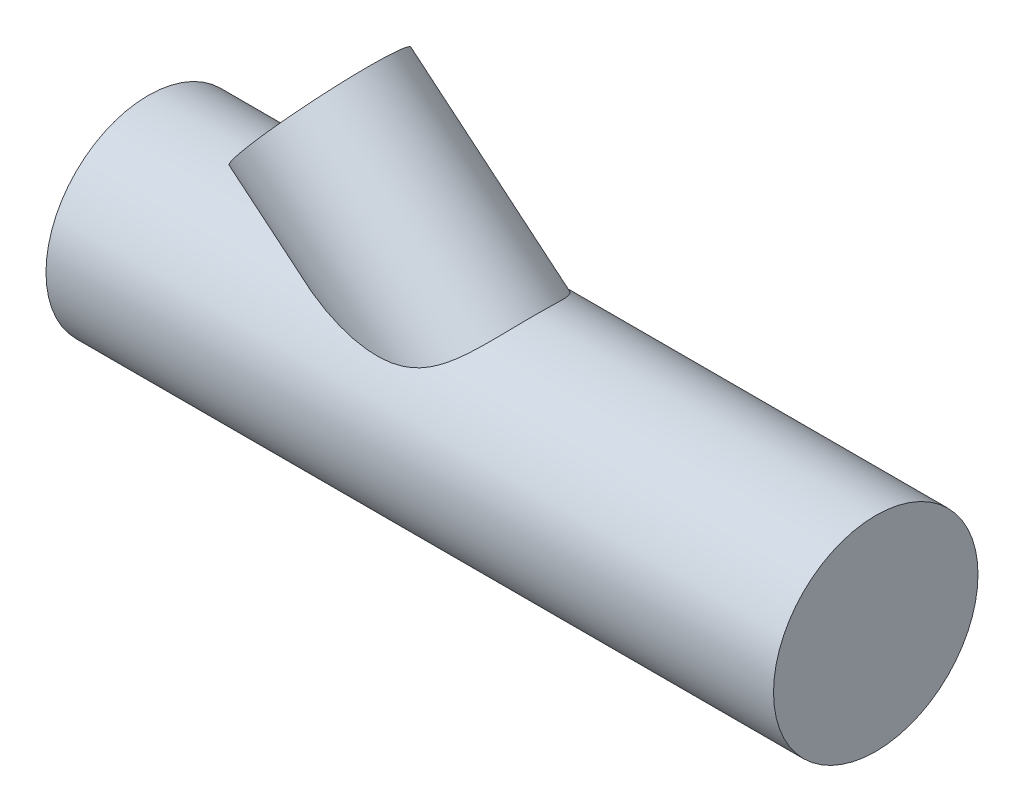
ISO-10303-21;
HEADER;
FILE_DESCRIPTION(('STEP AP214'),'2;1');
FILE_NAME('part.step','',(''),(''),'','','');
FILE_SCHEMA(('AUTOMOTIVE_DESIGN { 1 0 10303 214 1 1 1 1 }'));
ENDSEC;
DATA;
#1=APPLICATION_CONTEXT('core data for automotive mechanical design processes');
#2=APPLICATION_PROTOCOL_DEFINITION('international standard','automotive_design',2000,#1);
#3=PRODUCT_CONTEXT('',#1,'mechanical');
#4=PRODUCT('Part','Part','',(#3));
#5=PRODUCT_RELATED_PRODUCT_CATEGORY('part','',(#4));
#6=PRODUCT_DEFINITION_FORMATION('','',#4);
#7=PRODUCT_DEFINITION_CONTEXT('part definition',#1,'design');
#8=PRODUCT_DEFINITION('design','',#6,#7);
#9=PRODUCT_DEFINITION_SHAPE('','',#8);
#10=(LENGTH_UNIT() NAMED_UNIT(*) SI_UNIT(.MILLI.,.METRE.));
#11=(NAMED_UNIT(*) PLANE_ANGLE_UNIT() SI_UNIT($,.RADIAN.));
#12=(NAMED_UNIT(*) SI_UNIT($,.STERADIAN.) SOLID_ANGLE_UNIT());
#13=UNCERTAINTY_MEASURE_WITH_UNIT(LENGTH_MEASURE(1.E-05),#10,'distance_accuracy_value','');
#14=(GEOMETRIC_REPRESENTATION_CONTEXT(3) GLOBAL_UNCERTAINTY_ASSIGNED_CONTEXT((#13)) GLOBAL_UNIT_ASSIGNED_CONTEXT((#10,
#11,#12)) REPRESENTATION_CONTEXT('',''));
#15=CARTESIAN_POINT('',(0.,0.,0.));
#16=DIRECTION('',(0.,0.,1.));
#17=DIRECTION('',(1.,0.,0.));
#18=AXIS2_PLACEMENT_3D('',#15,#16,#17);
#19=CARTESIAN_POINT('',(-69.3240097841989,11.2302504074532,0.));
#20=DIRECTION('',(-1.,0.,0.));
#21=DIRECTION('',(0.,0.,1.));
#22=AXIS2_PLACEMENT_3D('',#19,#20,#21);
#23=CYLINDRICAL_SURFACE('',#22,20.);
#24=CARTESIAN_POINT('',(-41.184294623135,31.2302504074532,0.));
#25=CARTESIAN_POINT('',(-41.1843007453889,31.2302523221821,0.182341949393127));
#26=CARTESIAN_POINT('',(-41.1760794548389,31.2277508187363,0.364651363194773));
#27=CARTESIAN_POINT('',(-41.1434673933116,31.2178307772749,0.727738182943005));
#28=CARTESIAN_POINT('',(-41.1190721718802,31.2104108859051,0.908515153349054));
#29=CARTESIAN_POINT('',(-41.054806669546,31.1908731819984,1.267222241119));
#30=CARTESIAN_POINT('',(-41.0149192496869,31.1787501664317,1.44514897748946));
#31=CARTESIAN_POINT('',(-40.9207622823634,31.1501508218525,1.79686700696883));
#32=CARTESIAN_POINT('',(-40.8664847499954,31.133672075912,1.97065594553462));
#33=CARTESIAN_POINT('',(-40.7295740212577,31.0921382267754,2.35624052389759));
#34=CARTESIAN_POINT('',(-40.6432425827465,31.0659684960298,2.56660377283578));
#35=CARTESIAN_POINT('',(-40.4528277599003,31.0083188261167,2.9784768082735));
#36=CARTESIAN_POINT('',(-40.3487306730452,30.9768347882684,3.17997960875396));
#37=CARTESIAN_POINT('',(-40.1252964520044,30.9093544452603,3.57391504231913));
#38=CARTESIAN_POINT('',(-40.0059364092499,30.8733513588701,3.76633343344665));
#39=CARTESIAN_POINT('',(-39.7544984828833,30.7976324206041,4.14176530727412));
#40=CARTESIAN_POINT('',(-39.6224234188366,30.757917391911,4.32478086131807));
#41=CARTESIAN_POINT('',(-39.2523713155507,30.6468440153372,4.80543001402198));
#42=CARTESIAN_POINT('',(-39.0043756261082,30.5726125098297,5.09470453167189));
#43=CARTESIAN_POINT('',(-38.4852772999326,30.417793958029,5.6498927404563));
#44=CARTESIAN_POINT('',(-38.2141572704137,30.3372021313363,5.91578853671824));
#45=CARTESIAN_POINT('',(-37.6537892098839,30.1713063383875,6.42718977624093));
#46=CARTESIAN_POINT('',(-37.3645069434699,30.0859935113614,6.67265455174706));
#47=CARTESIAN_POINT('',(-36.7722828744136,29.9121307688216,7.14497276277682));
#48=CARTESIAN_POINT('',(-36.4693442783918,29.8235816141392,7.3718305324703));
#49=CARTESIAN_POINT('',(-35.8263725867564,29.6365826146875,7.8276862312333));
#50=CARTESIAN_POINT('',(-35.4853732894274,29.5379302987127,8.05523184191089));
#51=CARTESIAN_POINT('',(-34.793060563868,29.3388541947419,8.49331138907191));
#52=CARTESIAN_POINT('',(-34.4417446834666,29.2384299878829,8.70384123568346));
#53=CARTESIAN_POINT('',(-33.7304169642613,29.0364631092258,9.10989799768386));
#54=CARTESIAN_POINT('',(-33.3703970295901,28.9349194480038,9.30541017879252));
#55=CARTESIAN_POINT('',(-32.64342672027,28.7314109315988,9.68273255995121));
#56=CARTESIAN_POINT('',(-32.2764768764458,28.62944610914,9.86454380419936));
#57=CARTESIAN_POINT('',(-31.535377657283,28.4252297142699,10.2163689221994));
#58=CARTESIAN_POINT('',(-31.1612074781347,28.3229783966418,10.3863389935026));
#59=CARTESIAN_POINT('',(-30.4077448695106,28.1189949804048,10.7148344930852));
#60=CARTESIAN_POINT('',(-30.0284523840036,28.0172628874924,10.8733597960532));
#61=CARTESIAN_POINT('',(-29.2655872118012,27.8147854302725,11.1797537546393));
#62=CARTESIAN_POINT('',(-28.8820169474239,27.7140395627205,11.3276281195327));
#63=CARTESIAN_POINT('',(-28.1108779276765,27.5138718728355,11.6135314243844));
#64=CARTESIAN_POINT('',(-27.723309040642,27.41445009435,11.7515600389552));
#65=CARTESIAN_POINT('',(-26.7558434303937,27.169550946172,12.0830203646673));
#66=CARTESIAN_POINT('',(-26.1737704842183,27.0251057833728,12.2708817776843));
#67=CARTESIAN_POINT('',(-25.0026015946016,26.7413304468585,12.6276805862511));
#68=CARTESIAN_POINT('',(-24.4135052080139,26.6020005981828,12.7966167806408));
#69=CARTESIAN_POINT('',(-23.228466875771,26.3298259197266,13.1166676485783));
#70=CARTESIAN_POINT('',(-22.6325197422309,26.1969864678364,13.2677676852305));
#71=CARTESIAN_POINT('',(-21.4347125401057,25.9396278578299,13.5525284897357));
#72=CARTESIAN_POINT('',(-20.8328526897229,25.8151083939868,13.6861898985617));
#73=CARTESIAN_POINT('',(-19.626004465507,25.5769233730746,13.9356586523522));
#74=CARTESIAN_POINT('',(-19.0210394703471,25.463214880854,14.0515378510393));
#75=CARTESIAN_POINT('',(-17.8056753107891,25.2485341353914,14.2657179321294));
#76=CARTESIAN_POINT('',(-17.1952756503545,25.1475630577537,14.3640171923347));
#77=CARTESIAN_POINT('',(-15.9700137210888,24.9615646551171,14.5419239042736));
#78=CARTESIAN_POINT('',(-15.3551571243517,24.8765198474676,14.621551876436));
#79=CARTESIAN_POINT('',(-14.1208288690634,24.7261355598482,14.7604739908352));
#80=CARTESIAN_POINT('',(-13.5013584942275,24.6607907941559,14.819773587969));
#81=CARTESIAN_POINT('',(-12.4235395967315,24.5688076688747,14.9025375243682));
#82=CARTESIAN_POINT('',(-11.9660881715901,24.5364987286243,14.9313362967078));
#83=CARTESIAN_POINT('',(-11.0496349653708,24.4875418732812,14.9748228345403));
#84=CARTESIAN_POINT('',(-10.5906332162021,24.4708936378031,14.9895108887094));
#85=CARTESIAN_POINT('',(-9.67159016831099,24.4559793895185,15.0026737928037));
#86=CARTESIAN_POINT('',(-9.21154829374636,24.4577311443586,15.0011329715797));
#87=CARTESIAN_POINT('',(-8.29239429348776,24.48271502331,14.9790687326327));
#88=CARTESIAN_POINT('',(-7.83328220628057,24.505948019092,14.9585445445984));
#89=CARTESIAN_POINT('',(-6.91076466950499,24.5776687692898,14.8945909486721));
#90=CARTESIAN_POINT('',(-6.44741536933756,24.6265713700258,14.8507851367348));
#91=CARTESIAN_POINT('',(-5.52788468848765,24.7529103539182,14.735841349731));
#92=CARTESIAN_POINT('',(-5.07170330052934,24.8303467081093,14.66470340241));
#93=CARTESIAN_POINT('',(-4.17314945183238,25.0154114048928,14.4908738123662));
#94=CARTESIAN_POINT('',(-3.73073533725785,25.1229362657135,14.3882902055688));
#95=CARTESIAN_POINT('',(-2.86443919912413,25.3682371143816,14.1473260588568));
#96=CARTESIAN_POINT('',(-2.4405483606065,25.5059985208934,14.0089627677016));
#97=CARTESIAN_POINT('',(-1.725986370668,25.7690205688895,13.7349907446392));
#98=CARTESIAN_POINT('',(-1.4295907183894,25.8880453243781,13.6082219044783));
#99=CARTESIAN_POINT('',(-0.852650073175731,26.1387872783424,13.3330480103471));
#100=CARTESIAN_POINT('',(-0.572102809676657,26.2705026513081,13.1846460666679));
#101=CARTESIAN_POINT('',(-0.0285022705618587,26.5439337933999,12.8660466638217));
#102=CARTESIAN_POINT('',(0.23453756266797,26.6856570784964,12.6958327439422));
#103=CARTESIAN_POINT('',(0.741666271303016,26.9757803569036,12.3341803210659));
#104=CARTESIAN_POINT('',(0.985753994212217,27.1241807553906,12.1427405290195));
#105=CARTESIAN_POINT('',(1.45343562898603,27.4236972300063,11.7403126121568));
#106=CARTESIAN_POINT('',(1.6771031705185,27.5748009922834,11.5294007222903));
#107=CARTESIAN_POINT('',(2.10484198632252,27.8770024493992,11.0885998743404));
#108=CARTESIAN_POINT('',(2.30891341004979,28.0281001442753,10.8587110610151));
#109=CARTESIAN_POINT('',(2.69775824921816,28.3273234208827,10.3812091780408));
#110=CARTESIAN_POINT('',(2.88252470468535,28.4754479152505,10.1335897698755));
#111=CARTESIAN_POINT('',(3.23312355792433,28.7659642747314,9.62212342709991));
#112=CARTESIAN_POINT('',(3.3989549273837,28.9083558282328,9.35827561236555));
#113=CARTESIAN_POINT('',(3.72663751486207,29.197758079841,8.79085787740335));
#114=CARTESIAN_POINT('',(3.88671884954538,29.3439884666357,8.48586676021133));
#115=CARTESIAN_POINT('',(4.18566817912434,29.6241151110524,7.86023187272508));
#116=CARTESIAN_POINT('',(4.32453519871244,29.7580108014864,7.539587383676));
#117=CARTESIAN_POINT('',(4.58176181080055,30.0112667219913,6.88453063323962));
#118=CARTESIAN_POINT('',(4.70011654623395,30.1306235074384,6.55011513417649));
#119=CARTESIAN_POINT('',(4.91686806608178,30.3529173961043,5.86956370306623));
#120=CARTESIAN_POINT('',(5.0152640574446,30.4558538468339,5.523427305932));
#121=CARTESIAN_POINT('',(5.20121764675877,30.6529520382365,4.78723510401548));
#122=CARTESIAN_POINT('',(5.28678729729245,30.7452837139604,4.39618434465219));
#123=CARTESIAN_POINT('',(5.43496696982371,30.9068023024675,3.6050436483374));
#124=CARTESIAN_POINT('',(5.49757555922096,30.9759877710748,3.20495314902577));
#125=CARTESIAN_POINT('',(5.60018663298074,31.0901009937998,2.3983854223836));
#126=CARTESIAN_POINT('',(5.64018497239832,31.1350243000742,1.99190703804491));
#127=CARTESIAN_POINT('',(5.69777322526161,31.1998822928224,1.1753889462584));
#128=CARTESIAN_POINT('',(5.71536315167687,31.2198169937591,0.765349240871925));
#129=CARTESIAN_POINT('',(5.72838889971942,31.2345674041004,-0.0657919570410926));
#130=CARTESIAN_POINT('',(5.72326033327052,31.2287431990943,-0.486913907081126));
#131=CARTESIAN_POINT('',(5.68953045665998,31.1906070008246,-1.32701989165936));
#132=CARTESIAN_POINT('',(5.66092861606954,31.1582944089992,-1.74600387767042));
#133=CARTESIAN_POINT('',(5.58008953573228,31.0677120819841,-2.57887280564923));
#134=CARTESIAN_POINT('',(5.52785137700951,31.0094413375471,-2.99275754871654));
#135=CARTESIAN_POINT('',(5.39943888903519,30.8679207387341,-3.81246458590924));
#136=CARTESIAN_POINT('',(5.32326465599163,30.7846709847581,-4.21828691243349));
#137=CARTESIAN_POINT('',(5.14643195967513,30.5945308626006,-5.01939191511329));
#138=CARTESIAN_POINT('',(5.04574750583501,30.4876154103727,-5.41466290565624));
#139=CARTESIAN_POINT('',(4.8193135041547,30.2521301160074,-6.19134520734847));
#140=CARTESIAN_POINT('',(4.6935636826465,30.1235600374434,-6.57275636711998));
#141=CARTESIAN_POINT('',(4.41614972311559,29.8471828138357,-7.31903050099216));
#142=CARTESIAN_POINT('',(4.26447499183287,29.6993678109687,-7.68388663306165));
#143=CARTESIAN_POINT('',(3.93429893618683,29.3876171467699,-8.39406906211678));
#144=CARTESIAN_POINT('',(3.75579810643726,29.2236817826809,-8.7393957190211));
#145=CARTESIAN_POINT('',(3.37427985863834,28.8864033281104,-9.40191575963984));
#146=CARTESIAN_POINT('',(3.17174331868322,28.7132736863989,-9.71949424048535));
#147=CARTESIAN_POINT('',(2.73880579469714,28.3593231163876,-10.3305135232691));
#148=CARTESIAN_POINT('',(2.50840474199757,28.1785021691342,-10.6239542657198));
#149=CARTESIAN_POINT('',(2.01941413681759,27.8144154708101,-11.18377422853));
#150=CARTESIAN_POINT('',(1.76086726436911,27.6311537812667,-11.4501932711193));
#151=CARTESIAN_POINT('',(1.21520816879757,27.2675125645753,-11.9541955697632));
#152=CARTESIAN_POINT('',(0.928100382010968,27.087132594849,-12.1917832914689));
#153=CARTESIAN_POINT('',(0.355704993330056,26.7524152185781,-12.6145901503167));
#154=CARTESIAN_POINT('',(0.0729996396070749,26.5972585651348,-12.802659960835));
#155=CARTESIAN_POINT('',(-0.513448475309098,26.2982832837782,-13.1532310337362));
#156=CARTESIAN_POINT('',(-0.817188659082968,26.154463271376,-13.3157354207214));
#157=CARTESIAN_POINT('',(-1.44328279319426,25.8818394096365,-13.615138013597));
#158=CARTESIAN_POINT('',(-1.76563017349566,25.7530303079921,-13.7520451861298));
#159=CARTESIAN_POINT('',(-2.4260483816731,25.5130451892493,-14.0011324219633));
#160=CARTESIAN_POINT('',(-2.7641208555516,25.4018710234593,-14.1133098896308));
#161=CARTESIAN_POINT('',(-3.49665726199716,25.1857097783087,-14.3272900909778));
#162=CARTESIAN_POINT('',(-3.89280866228887,25.0833265191993,-14.4259377804557));
#163=CARTESIAN_POINT('',(-4.6962591401975,24.9033538029371,-14.5966300213499));
#164=CARTESIAN_POINT('',(-5.10356027426685,24.8257689535009,-14.6686696291863));
#165=CARTESIAN_POINT('',(-5.9259402554116,24.6942205853806,-14.7895052959952));
#166=CARTESIAN_POINT('',(-6.34103058451478,24.6402953560234,-14.8382636892028));
#167=CARTESIAN_POINT('',(-7.17526271805587,24.5542616141748,-14.9155636527614));
#168=CARTESIAN_POINT('',(-7.59440472559423,24.5221542011679,-14.9441042042601));
#169=CARTESIAN_POINT('',(-8.38644077073335,24.4799384860123,-14.9815357502654));
#170=CARTESIAN_POINT('',(-8.75914494693722,24.4677351146753,-14.9922998552248));
#171=CARTESIAN_POINT('',(-9.50494554512562,24.4568881612678,-15.0018699511078));
#172=CARTESIAN_POINT('',(-9.87804202808169,24.4582471505581,-15.0006736743985));
#173=CARTESIAN_POINT('',(-10.6240662920663,24.4729346131885,-14.9877082440337));
#174=CARTESIAN_POINT('',(-10.9969937350228,24.4862720904295,-14.9759311370559));
#175=CARTESIAN_POINT('',(-11.7418647949245,24.5234610454157,-14.9429301911135));
#176=CARTESIAN_POINT('',(-12.1138084622397,24.5473119739553,-14.9217068456044));
#177=CARTESIAN_POINT('',(-12.8586383836934,24.6043930814679,-14.8705675924237));
#178=CARTESIAN_POINT('',(-13.2315166892514,24.6376792267484,-14.8405997835651));
#179=CARTESIAN_POINT('',(-13.9757219537372,24.7124010687169,-14.7727505058554));
#180=CARTESIAN_POINT('',(-14.3470489094569,24.7538367822492,-14.7348690206475));
#181=CARTESIAN_POINT('',(-15.0878223365204,24.8438170363231,-14.6517763632672));
#182=CARTESIAN_POINT('',(-15.457269637802,24.8923580946365,-14.6065687803552));
#183=CARTESIAN_POINT('',(-16.1943880587374,24.9956835800718,-14.5092345296434));
#184=CARTESIAN_POINT('',(-16.562059083308,25.0504683376392,-14.4571074956103));
#185=CARTESIAN_POINT('',(-17.3166238224518,25.1688172987472,-14.3430641418534));
#186=CARTESIAN_POINT('',(-17.7034076422214,25.23270514391,-14.280757351183));
#187=CARTESIAN_POINT('',(-18.4748410803908,25.365818802088,-14.1490096945827));
#188=CARTESIAN_POINT('',(-18.8594906112853,25.4350448322593,-14.0795685383906));
#189=CARTESIAN_POINT('',(-20.0102712163688,25.6497048179081,-13.8607755055824));
#190=CARTESIAN_POINT('',(-20.773144699103,25.8021062868356,-13.7009676904946));
#191=CARTESIAN_POINT('',(-22.2909833749492,26.1212660436206,-13.3534072326979));
#192=CARTESIAN_POINT('',(-23.0459310650174,26.2880507057965,-13.1656027729768));
#193=CARTESIAN_POINT('',(-24.5455734019483,26.6321896463698,-12.7612996136961));
#194=CARTESIAN_POINT('',(-25.2902692515477,26.8095426716611,-12.5448043123402));
#195=CARTESIAN_POINT('',(-26.7623175622623,27.1704612409028,-12.082841285376));
#196=CARTESIAN_POINT('',(-27.4897608088692,27.3539662317839,-11.8376174098989));
#197=CARTESIAN_POINT('',(-28.5708775960128,27.6329429567997,-11.4445369032246));
#198=CARTESIAN_POINT('',(-28.9296378296597,27.726571984393,-11.3092764247493));
#199=CARTESIAN_POINT('',(-29.6433946028244,27.9147463864135,-11.0297778596501));
#200=CARTESIAN_POINT('',(-29.9983913131015,28.0092917188902,-10.8855401823993));
#201=CARTESIAN_POINT('',(-30.7032496746406,28.1987274577026,-10.5878155087293));
#202=CARTESIAN_POINT('',(-31.0531222348121,28.2936163384922,-10.4343534066856));
#203=CARTESIAN_POINT('',(-31.7480542209764,28.483630141796,-10.1170690973583));
#204=CARTESIAN_POINT('',(-32.0931139792677,28.5787550474744,-9.95324760970118));
#205=CARTESIAN_POINT('',(-32.7775032314849,28.7688143457535,-9.6143901122143));
#206=CARTESIAN_POINT('',(-33.116835723113,28.8637488135581,-9.43936021445739));
#207=CARTESIAN_POINT('',(-33.7889516359836,29.0530330450184,-9.07690654092525));
#208=CARTESIAN_POINT('',(-34.1217358833599,29.1473828813894,-8.88948434175469));
#209=CARTESIAN_POINT('',(-34.7274445520195,29.3201380944638,-8.53164280226651));
#210=CARTESIAN_POINT('',(-35.0015061234381,29.398703343323,-8.36322799593725));
#211=CARTESIAN_POINT('',(-35.5431383155271,29.5546892106819,-8.01568688021448));
#212=CARTESIAN_POINT('',(-35.8107084992046,29.6321097519849,-7.83655985248342));
#213=CARTESIAN_POINT('',(-36.338548888758,29.7854820715788,-7.46616619027439));
#214=CARTESIAN_POINT('',(-36.5988048750794,29.8614309102659,-7.27487798940506));
#215=CARTESIAN_POINT('',(-37.1098348585058,30.0111338995038,-6.87918388981037));
#216=CARTESIAN_POINT('',(-37.3606091919204,30.0848881278767,-6.67477845704154));
#217=CARTESIAN_POINT('',(-37.8531592493393,30.2302521165844,-6.24908628155637));
#218=CARTESIAN_POINT('',(-38.0948076309127,30.301829878739,-6.02764027973427));
#219=CARTESIAN_POINT('',(-38.563239831427,30.4410157748115,-5.56813799067158));
#220=CARTESIAN_POINT('',(-38.7900193831112,30.5086227685699,-5.33007697514949));
#221=CARTESIAN_POINT('',(-39.2240228140741,30.6383605389864,-4.83634191259987));
#222=CARTESIAN_POINT('',(-39.4312971570963,30.7005054180355,-4.58071645237301));
#223=CARTESIAN_POINT('',(-39.8214084561543,30.8177387901807,-4.05019780725249));
#224=CARTESIAN_POINT('',(-40.0042679229717,30.8728337813709,-3.7753227322949));
#225=CARTESIAN_POINT('',(-40.3609580029638,30.9805027931317,-3.16772073669277));
#226=CARTESIAN_POINT('',(-40.5304598616621,31.0317987218645,-2.83213433108374));
#227=CARTESIAN_POINT('',(-40.7455423793743,31.0969806328362,-2.31162418002936));
#228=CARTESIAN_POINT('',(-40.8106753480874,31.1167376061557,-2.13539869936306));
#229=CARTESIAN_POINT('',(-40.9264739238619,31.1518837693425,-1.77785281990224));
#230=CARTESIAN_POINT('',(-40.977144484167,31.1672744546129,-1.59653418889163));
#231=CARTESIAN_POINT('',(-41.0737366632522,31.1966249929747,-1.1821400910285));
#232=CARTESIAN_POINT('',(-41.1150057577236,31.2091747038364,-0.947854694426336));
#233=CARTESIAN_POINT('',(-41.1702832330013,31.2259869187231,-0.475694848152122));
#234=CARTESIAN_POINT('',(-41.1842866381766,31.2302479101654,-0.237819751386866));
#235=CARTESIAN_POINT('',(-41.184294623135,31.2302504074532,0.));
#236=B_SPLINE_CURVE_WITH_KNOTS('',3,(#24,#25,#26,#27,#28,#29,#30,#31,#32,#33,#34,#35,#36,#37,
#38,#39,#40,#41,#42,#43,#44,#45,#46,#47,#48,#49,#50,#51,#52,#53,#54,#55,#56,#57,#58,#59,#60,#61,
#62,#63,#64,#65,#66,#67,#68,#69,#70,#71,#72,#73,#74,#75,#76,#77,#78,#79,#80,#81,#82,#83,#84,#85,
#86,#87,#88,#89,#90,#91,#92,#93,#94,#95,#96,#97,#98,#99,#100,#101,#102,#103,#104,#105,#106,#107,
#108,#109,#110,#111,#112,#113,#114,#115,#116,#117,#118,#119,#120,#121,#122,#123,#124,#125,#126,
#127,#128,#129,#130,#131,#132,#133,#134,#135,#136,#137,#138,#139,#140,#141,#142,#143,#144,#145,
#146,#147,#148,#149,#150,#151,#152,#153,#154,#155,#156,#157,#158,#159,#160,#161,#162,#163,#164,
#165,#166,#167,#168,#169,#170,#171,#172,#173,#174,#175,#176,#177,#178,#179,#180,#181,#182,#183,
#184,#185,#186,#187,#188,#189,#190,#191,#192,#193,#194,#195,#196,#197,#198,#199,#200,#201,#202,
#203,#204,#205,#206,#207,#208,#209,#210,#211,#212,#213,#214,#215,#216,#217,#218,#219,#220,#221,
#222,#223,#224,#225,#226,#227,#228,#229,#230,#231,#232,#233,#234,#235),.UNSPECIFIED.,.T.,.F.,(4,
2,2,2,2,2,2,2,2,2,2,2,2,2,2,2,2,2,2,2,2,2,2,2,2,2,2,2,2,2,2,2,2,2,2,2,2,2,2,2,2,2,2,2,2,2,2,2,2,
2,2,2,2,2,2,2,2,2,2,2,2,2,2,2,2,2,2,2,2,2,2,2,2,2,2,2,2,2,2,2,2,2,2,2,2,2,2,2,2,2,2,2,2,2,2,2,2,
2,2,2,2,2,2,2,2,4),(0.,0.546770750293846,1.09369201368875,1.64122006522669,2.18905257181518,
2.87464870677702,3.56077604701244,4.24794557451247,4.93496307112244,6.09757104035978,
7.26106130006799,8.42681469102589,9.59229576479009,10.8566885269708,12.1213842976092,
13.3873054567315,14.6531300376264,15.9234125463587,17.1937089615958,18.4633193063185,
19.7329715903623,21.6179684958793,23.5030849721095,25.3897378333267,27.2763213293223,
29.1550685924276,31.0339891285273,32.9108348806386,34.7871766067814,36.1652565108291,
37.5433082216221,38.922690747518,40.3021292487596,41.7045802151518,43.1070297578867,
44.5047139924043,45.9017256798907,46.9314452041984,47.9610168267346,48.991370056793,
50.0217858946275,51.0483260571188,52.0748583897696,53.1017595478135,54.1287164475361,
55.2501567371387,56.371648568364,57.4934055938644,58.6152071831424,59.8462284530548,
61.0773265165246,62.3086501936083,63.539973158026,64.8020546993304,66.0641647608498,
67.3263238972071,68.5884779605431,69.8519762833795,71.1154884020642,72.3795180481307,
73.6435243911533,74.8855268826427,76.1275324349547,77.3676801880254,78.607635610156,
79.7260015748697,80.8442307466883,81.9620674686016,83.0800214630054,84.3407633954221,
85.6017394464495,86.8647487261926,88.1278216491565,89.2465220806734,90.3654346166474,
91.4851889130762,92.6048847223051,93.7313663736995,94.8578503534504,95.9837840964561,
97.1097774567595,98.3004952702608,99.4912615474272,101.873069161044,104.259341120927,
106.645330697916,109.012363706822,110.196299673749,111.380181691013,112.56100087921,
113.741738130383,114.921836906511,116.101785832951,117.094962940578,118.088206723277,
119.0832638862,120.078285721776,121.084116339714,122.090234372176,123.093673374937,
124.096180711223,125.230155952418,125.796329102301,126.362308109694,127.07530455175,
127.788431094124),.UNSPECIFIED.);
#237=CARTESIAN_POINT('',(-41.184294623135,31.2302504074532,0.));
#238=VERTEX_POINT('',#237);
#239=EDGE_CURVE('E10',#238,#238,#236,.T.);
#240=ORIENTED_EDGE('',*,*,#239,.F.);
#241=EDGE_LOOP('',(#240));
#242=FACE_BOUND('',#241,.T.);
#243=CARTESIAN_POINT('',(72.9922253976182,11.2302504074532,0.));
#244=DIRECTION('',(-1.,0.,0.));
#245=DIRECTION('',(0.,0.,1.));
#246=AXIS2_PLACEMENT_3D('',#243,#244,#245);
#247=CIRCLE('',#246,20.);
#248=CARTESIAN_POINT('',(72.9922253976182,11.2302504074532,20.));
#249=VERTEX_POINT('',#248);
#250=EDGE_CURVE('E59',#249,#249,#247,.T.);
#251=ORIENTED_EDGE('',*,*,#250,.T.);
#252=EDGE_LOOP('',(#251));
#253=FACE_BOUND('',#252,.T.);
#254=CARTESIAN_POINT('',(-69.3240097841989,11.2302504074532,0.));
#255=DIRECTION('',(-1.,0.,0.));
#256=DIRECTION('',(0.,0.,1.));
#257=AXIS2_PLACEMENT_3D('',#254,#255,#256);
#258=CIRCLE('',#257,20.);
#259=CARTESIAN_POINT('',(-69.3240097841989,11.2302504074532,20.));
#260=VERTEX_POINT('',#259);
#261=EDGE_CURVE('E53',#260,#260,#258,.T.);
#262=ORIENTED_EDGE('',*,*,#261,.F.);
#263=EDGE_LOOP('',(#262));
#264=FACE_BOUND('',#263,.T.);
#265=ADVANCED_FACE('F43',(#242,#253,#264),#23,.T.);
#266=CARTESIAN_POINT('',(-69.3240097841989,-8.76974959254677,0.));
#267=DIRECTION('',(1.,0.,0.));
#268=DIRECTION('',(0.,0.,-1.));
#269=AXIS2_PLACEMENT_3D('',#266,#267,#268);
#270=PLANE('',#269);
#271=ORIENTED_EDGE('',*,*,#261,.T.);
#272=EDGE_LOOP('',(#271));
#273=FACE_BOUND('',#272,.T.);
#274=ADVANCED_FACE('F79',(#273),#270,.F.);
#275=CARTESIAN_POINT('',(72.9922253976182,11.2302504074532,0.));
#276=DIRECTION('',(-1.,0.,0.));
#277=DIRECTION('',(0.,0.,1.));
#278=AXIS2_PLACEMENT_3D('',#275,#276,#277);
#279=PLANE('',#278);
#280=ORIENTED_EDGE('',*,*,#250,.F.);
#281=EDGE_LOOP('',(#280));
#282=FACE_BOUND('',#281,.T.);
#283=ADVANCED_FACE('F72',(#282),#279,.F.);
#284=CARTESIAN_POINT('',(-35.7470988258107,46.2189511435568,0.));
#285=DIRECTION('',(-0.768759581080136,0.639537885115099,0.));
#286=DIRECTION('',(-0.639537885115099,-0.768759581080136,0.));
#287=AXIS2_PLACEMENT_3D('',#284,#285,#286);
#288=CYLINDRICAL_SURFACE('',#287,15.);
#289=ORIENTED_EDGE('',*,*,#239,.T.);
#290=EDGE_LOOP('',(#289));
#291=FACE_BOUND('',#290,.T.);
#292=CARTESIAN_POINT('',(-35.7470988258107,46.2189511435568,0.));
#293=DIRECTION('',(-0.768759581080136,0.639537885115099,0.));
#294=DIRECTION('',(-0.639537885115099,-0.768759581080136,0.));
#295=AXIS2_PLACEMENT_3D('',#292,#293,#294);
#296=CIRCLE('',#295,15.);
#297=CARTESIAN_POINT('',(-45.3401671025372,34.6875574273548,0.));
#298=VERTEX_POINT('',#297);
#299=EDGE_CURVE('E65',#298,#298,#296,.T.);
#300=ORIENTED_EDGE('',*,*,#299,.F.);
#301=EDGE_LOOP('',(#300));
#302=FACE_BOUND('',#301,.T.);
#303=ADVANCED_FACE('F69',(#291,#302),#288,.T.);
#304=CARTESIAN_POINT('',(-45.3401671025372,34.6875574273548,0.));
#305=DIRECTION('',(0.768759581080136,-0.639537885115099,0.));
#306=DIRECTION('',(0.639537885115099,0.768759581080136,0.));
#307=AXIS2_PLACEMENT_3D('',#304,#305,#306);
#308=PLANE('',#307);
#309=ORIENTED_EDGE('',*,*,#299,.T.);
#310=EDGE_LOOP('',(#309));
#311=FACE_BOUND('',#310,.T.);
#312=ADVANCED_FACE('F67',(#311),#308,.F.);
#313=CLOSED_SHELL('',(#265,#274,#283,#303,#312));
#314=MANIFOLD_SOLID_BREP('B2',#313);
#315=ADVANCED_BREP_SHAPE_REPRESENTATION('',(#18,#314),#14);
#316=SHAPE_DEFINITION_REPRESENTATION(#9,#315);
ENDSEC;
END-ISO-10303-21;
